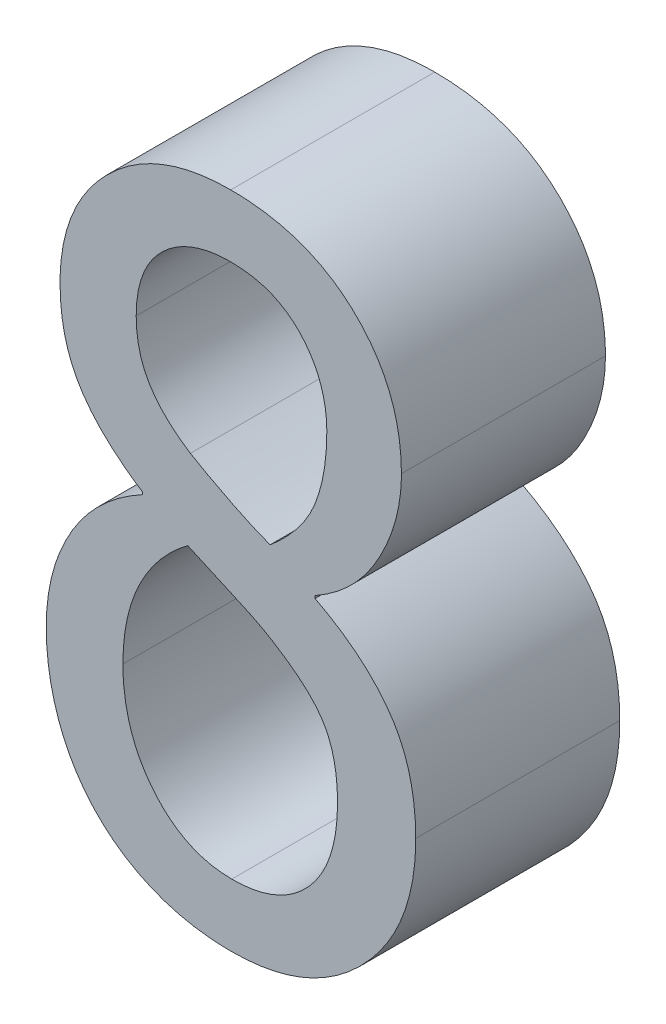
ISO-10303-21;
HEADER;
FILE_DESCRIPTION(('STEP AP214'),'2;1');
FILE_NAME('part.step','',(''),(''),'','','');
FILE_SCHEMA(('AUTOMOTIVE_DESIGN { 1 0 10303 214 1 1 1 1 }'));
ENDSEC;
DATA;
#1=APPLICATION_CONTEXT('core data for automotive mechanical design processes');
#2=APPLICATION_PROTOCOL_DEFINITION('international standard','automotive_design',2000,#1);
#3=PRODUCT_CONTEXT('',#1,'mechanical');
#4=PRODUCT('Part','Part','',(#3));
#5=PRODUCT_RELATED_PRODUCT_CATEGORY('part','',(#4));
#6=PRODUCT_DEFINITION_FORMATION('','',#4);
#7=PRODUCT_DEFINITION_CONTEXT('part definition',#1,'design');
#8=PRODUCT_DEFINITION('design','',#6,#7);
#9=PRODUCT_DEFINITION_SHAPE('','',#8);
#10=(LENGTH_UNIT() NAMED_UNIT(*) SI_UNIT(.MILLI.,.METRE.));
#11=(NAMED_UNIT(*) PLANE_ANGLE_UNIT() SI_UNIT($,.RADIAN.));
#12=(NAMED_UNIT(*) SI_UNIT($,.STERADIAN.) SOLID_ANGLE_UNIT());
#13=UNCERTAINTY_MEASURE_WITH_UNIT(LENGTH_MEASURE(1.E-05),#10,'distance_accuracy_value','');
#14=(GEOMETRIC_REPRESENTATION_CONTEXT(3) GLOBAL_UNCERTAINTY_ASSIGNED_CONTEXT((#13)) GLOBAL_UNIT_ASSIGNED_CONTEXT((#10,
#11,#12)) REPRESENTATION_CONTEXT('',''));
#15=CARTESIAN_POINT('',(0.,0.,0.));
#16=DIRECTION('',(0.,0.,1.));
#17=DIRECTION('',(1.,0.,0.));
#18=AXIS2_PLACEMENT_3D('',#15,#16,#17);
#19=CARTESIAN_POINT('',(-3.974147968209,0.364519019429397,0.));
#20=CARTESIAN_POINT('',(-3.974147968209,0.364519019429397,0.1));
#21=CARTESIAN_POINT('',(-3.957866192846,0.378295906275356,0.));
#22=CARTESIAN_POINT('',(-3.957866192846,0.378295906275356,0.1));
#23=CARTESIAN_POINT('',(-3.946343705665,0.407603101929486,0.));
#24=CARTESIAN_POINT('',(-3.946343705665,0.407603101929486,0.1));
#25=CARTESIAN_POINT('',(-3.946343705665,0.426389765810338,0.));
#26=CARTESIAN_POINT('',(-3.946343705665,0.426389765810338,0.1));
#27=B_SPLINE_SURFACE_WITH_KNOTS('',2,1,((#19,#20),(#21,#22),(#23,#24),(#25,#26)),.UNSPECIFIED.,
.F.,.F.,.F.,(3,1,3),(2,2),(0.,1.,2.),(0.,0.01),.UNSPECIFIED.);
#28=CARTESIAN_POINT('',(-3.974147968209,0.364519019429397,0.));
#29=CARTESIAN_POINT('',(-3.957866192846,0.378295906275356,0.));
#30=CARTESIAN_POINT('',(-3.946343705665,0.407603101929486,0.));
#31=CARTESIAN_POINT('',(-3.946343705665,0.426389765810338,0.));
#32=B_SPLINE_CURVE_WITH_KNOTS('',2,(#28,#29,#30,#31),.UNSPECIFIED.,.F.,.F.,(3,1,3),(0.,1.,2.),.UNSPECIFIED.);
#33=CARTESIAN_POINT('',(-3.974147968209,0.364519019429397,0.));
#34=VERTEX_POINT('',#33);
#35=CARTESIAN_POINT('',(-3.946343705665,0.426389765810338,0.));
#36=VERTEX_POINT('',#35);
#37=EDGE_CURVE('E11',#34,#36,#32,.T.);
#38=DIRECTION('',(0.,0.,1.));
#39=VECTOR('',#38,1.);
#40=CARTESIAN_POINT('',(-3.974147968209,0.364519019429397,0.));
#41=LINE('',#40,#39);
#42=CARTESIAN_POINT('',(-3.974147968209,0.364519019429397,0.1));
#43=VERTEX_POINT('',#42);
#44=EDGE_CURVE('E28',#34,#43,#41,.T.);
#45=CARTESIAN_POINT('',(-3.946343705665,0.426389765810338,0.1));
#46=CARTESIAN_POINT('',(-3.946343705665,0.407603101929486,0.1));
#47=CARTESIAN_POINT('',(-3.957866192846,0.378295906275356,0.1));
#48=CARTESIAN_POINT('',(-3.974147968209,0.364519019429397,0.1));
#49=B_SPLINE_CURVE_WITH_KNOTS('',2,(#45,#46,#47,#48),.UNSPECIFIED.,.F.,.F.,(3,1,3),(-2.,-1.,0.),.UNSPECIFIED.);
#50=CARTESIAN_POINT('',(-3.946343705665,0.426389765810338,0.1));
#51=VERTEX_POINT('',#50);
#52=EDGE_CURVE('E513',#51,#43,#49,.T.);
#53=DIRECTION('',(0.,0.,1.));
#54=VECTOR('',#53,1.);
#55=CARTESIAN_POINT('',(-3.946343705665,0.426389765810338,0.));
#56=LINE('',#55,#54);
#57=EDGE_CURVE('E41',#36,#51,#56,.T.);
#58=ORIENTED_EDGE('',*,*,#37,.F.);
#59=ORIENTED_EDGE('',*,*,#44,.T.);
#60=ORIENTED_EDGE('',*,*,#52,.F.);
#61=ORIENTED_EDGE('',*,*,#57,.F.);
#62=EDGE_LOOP('',(#58,#59,#60,#61));
#63=FACE_BOUND('',#62,.T.);
#64=ADVANCED_FACE('F17',(#63),#27,.F.);
#65=CARTESIAN_POINT('',(-4.013224229081,0.383806661013739,0.));
#66=CARTESIAN_POINT('',(-4.013224229081,0.383806661013739,0.1));
#67=CARTESIAN_POINT('',(-4.007462985491,0.380299817089313,0.));
#68=CARTESIAN_POINT('',(-4.007462985491,0.380299817089313,0.1));
#69=CARTESIAN_POINT('',(-3.983666544575,0.368025863353823,0.));
#70=CARTESIAN_POINT('',(-3.983666544575,0.368025863353823,0.1));
#71=CARTESIAN_POINT('',(-3.974147968209,0.364519019429397,0.));
#72=CARTESIAN_POINT('',(-3.974147968209,0.364519019429397,0.1));
#73=B_SPLINE_SURFACE_WITH_KNOTS('',2,1,((#65,#66),(#67,#68),(#69,#70),(#71,#72)),.UNSPECIFIED.,
.F.,.F.,.F.,(3,1,3),(2,2),(0.,1.,2.),(0.,0.01),.UNSPECIFIED.);
#74=CARTESIAN_POINT('',(-4.013224229081,0.383806661013739,0.));
#75=CARTESIAN_POINT('',(-4.007462985491,0.380299817089313,0.));
#76=CARTESIAN_POINT('',(-3.983666544575,0.368025863353823,0.));
#77=CARTESIAN_POINT('',(-3.974147968209,0.364519019429397,0.));
#78=B_SPLINE_CURVE_WITH_KNOTS('',2,(#74,#75,#76,#77),.UNSPECIFIED.,.F.,.F.,(3,1,3),(0.,1.,2.),.UNSPECIFIED.);
#79=CARTESIAN_POINT('',(-4.013224229081,0.383806661013739,0.));
#80=VERTEX_POINT('',#79);
#81=EDGE_CURVE('E504',#80,#34,#78,.T.);
#82=DIRECTION('',(0.,0.,1.));
#83=VECTOR('',#82,1.);
#84=CARTESIAN_POINT('',(-4.013224229081,0.383806661013739,0.));
#85=LINE('',#84,#83);
#86=CARTESIAN_POINT('',(-4.013224229081,0.383806661013739,0.1));
#87=VERTEX_POINT('',#86);
#88=EDGE_CURVE('E498',#80,#87,#85,.T.);
#89=CARTESIAN_POINT('',(-3.974147968209,0.364519019429397,0.1));
#90=CARTESIAN_POINT('',(-3.983666544575,0.368025863353823,0.1));
#91=CARTESIAN_POINT('',(-4.007462985491,0.380299817089313,0.1));
#92=CARTESIAN_POINT('',(-4.013224229081,0.383806661013739,0.1));
#93=B_SPLINE_CURVE_WITH_KNOTS('',2,(#89,#90,#91,#92),.UNSPECIFIED.,.F.,.F.,(3,1,3),(-2.,-1.,0.),.UNSPECIFIED.);
#94=EDGE_CURVE('E491',#43,#87,#93,.T.);
#95=ORIENTED_EDGE('',*,*,#81,.F.);
#96=ORIENTED_EDGE('',*,*,#88,.T.);
#97=ORIENTED_EDGE('',*,*,#94,.F.);
#98=ORIENTED_EDGE('',*,*,#44,.F.);
#99=EDGE_LOOP('',(#95,#96,#97,#98));
#100=FACE_BOUND('',#99,.T.);
#101=ADVANCED_FACE('F519',(#100),#73,.F.);
#102=CARTESIAN_POINT('',(-4.039776047366,0.428894654327785,0.));
#103=CARTESIAN_POINT('',(-4.039776047366,0.428894654327785,0.1));
#104=CARTESIAN_POINT('',(-4.039776047366,0.413614834371358,0.));
#105=CARTESIAN_POINT('',(-4.039776047366,0.413614834371358,0.1));
#106=CARTESIAN_POINT('',(-4.026500138224,0.392323281973059,0.));
#107=CARTESIAN_POINT('',(-4.026500138224,0.392323281973059,0.1));
#108=CARTESIAN_POINT('',(-4.013224229081,0.383806661013739,0.));
#109=CARTESIAN_POINT('',(-4.013224229081,0.383806661013739,0.1));
#110=B_SPLINE_SURFACE_WITH_KNOTS('',2,1,((#102,#103),(#104,#105),(#106,#107),(#108,#109)),
.UNSPECIFIED.,.F.,.F.,.F.,(3,1,3),(2,2),(0.,1.,2.),(0.,0.01),.UNSPECIFIED.);
#111=CARTESIAN_POINT('',(-4.039776047366,0.428894654327785,0.));
#112=CARTESIAN_POINT('',(-4.039776047366,0.413614834371358,0.));
#113=CARTESIAN_POINT('',(-4.026500138224,0.392323281973059,0.));
#114=CARTESIAN_POINT('',(-4.013224229081,0.383806661013739,0.));
#115=B_SPLINE_CURVE_WITH_KNOTS('',2,(#111,#112,#113,#114),.UNSPECIFIED.,.F.,.F.,(3,1,3),(0.,1.,
2.),.UNSPECIFIED.);
#116=CARTESIAN_POINT('',(-4.039776047366,0.428894654327785,0.));
#117=VERTEX_POINT('',#116);
#118=EDGE_CURVE('E486',#117,#80,#115,.T.);
#119=DIRECTION('',(0.,0.,1.));
#120=VECTOR('',#119,1.);
#121=CARTESIAN_POINT('',(-4.039776047366,0.428894654327785,0.));
#122=LINE('',#121,#120);
#123=CARTESIAN_POINT('',(-4.039776047366,0.428894654327785,0.1));
#124=VERTEX_POINT('',#123);
#125=EDGE_CURVE('E480',#117,#124,#122,.T.);
#126=CARTESIAN_POINT('',(-4.013224229081,0.383806661013739,0.1));
#127=CARTESIAN_POINT('',(-4.026500138224,0.392323281973059,0.1));
#128=CARTESIAN_POINT('',(-4.039776047366,0.413614834371358,0.1));
#129=CARTESIAN_POINT('',(-4.039776047366,0.428894654327785,0.1));
#130=B_SPLINE_CURVE_WITH_KNOTS('',2,(#126,#127,#128,#129),.UNSPECIFIED.,.F.,.F.,(3,1,3),(-2.,
-1.,0.),.UNSPECIFIED.);
#131=EDGE_CURVE('E473',#87,#124,#130,.T.);
#132=ORIENTED_EDGE('',*,*,#118,.F.);
#133=ORIENTED_EDGE('',*,*,#125,.T.);
#134=ORIENTED_EDGE('',*,*,#131,.F.);
#135=ORIENTED_EDGE('',*,*,#88,.F.);
#136=EDGE_LOOP('',(#132,#133,#134,#135));
#137=FACE_BOUND('',#136,.T.);
#138=ADVANCED_FACE('F533',(#137),#110,.F.);
#139=CARTESIAN_POINT('',(-3.993435609793,0.47498460304881,0.));
#140=CARTESIAN_POINT('',(-3.993435609793,0.47498460304881,0.1));
#141=CARTESIAN_POINT('',(-4.013975695636,0.47498460304881,0.));
#142=CARTESIAN_POINT('',(-4.013975695636,0.47498460304881,0.1));
#143=CARTESIAN_POINT('',(-4.039776047366,0.450186206726085,0.));
#144=CARTESIAN_POINT('',(-4.039776047366,0.450186206726085,0.1));
#145=CARTESIAN_POINT('',(-4.039776047366,0.428894654327785,0.));
#146=CARTESIAN_POINT('',(-4.039776047366,0.428894654327785,0.1));
#147=B_SPLINE_SURFACE_WITH_KNOTS('',2,1,((#139,#140),(#141,#142),(#143,#144),(#145,#146)),
.UNSPECIFIED.,.F.,.F.,.F.,(3,1,3),(2,2),(0.,1.,2.),(0.,0.01),.UNSPECIFIED.);
#148=CARTESIAN_POINT('',(-3.993435609793,0.47498460304881,0.));
#149=CARTESIAN_POINT('',(-4.013975695636,0.47498460304881,0.));
#150=CARTESIAN_POINT('',(-4.039776047366,0.450186206726085,0.));
#151=CARTESIAN_POINT('',(-4.039776047366,0.428894654327785,0.));
#152=B_SPLINE_CURVE_WITH_KNOTS('',2,(#148,#149,#150,#151),.UNSPECIFIED.,.F.,.F.,(3,1,3),(0.,1.,
2.),.UNSPECIFIED.);
#153=CARTESIAN_POINT('',(-3.993435609793,0.47498460304881,0.));
#154=VERTEX_POINT('',#153);
#155=EDGE_CURVE('E468',#154,#117,#152,.T.);
#156=DIRECTION('',(0.,0.,1.));
#157=VECTOR('',#156,1.);
#158=CARTESIAN_POINT('',(-3.993435609793,0.47498460304881,0.));
#159=LINE('',#158,#157);
#160=CARTESIAN_POINT('',(-3.993435609793,0.47498460304881,0.1));
#161=VERTEX_POINT('',#160);
#162=EDGE_CURVE('E462',#154,#161,#159,.T.);
#163=CARTESIAN_POINT('',(-4.039776047366,0.428894654327785,0.1));
#164=CARTESIAN_POINT('',(-4.039776047366,0.450186206726085,0.1));
#165=CARTESIAN_POINT('',(-4.013975695636,0.47498460304881,0.1));
#166=CARTESIAN_POINT('',(-3.993435609793,0.47498460304881,0.1));
#167=B_SPLINE_CURVE_WITH_KNOTS('',2,(#163,#164,#165,#166),.UNSPECIFIED.,.F.,.F.,(3,1,3),(-2.,
-1.,0.),.UNSPECIFIED.);
#168=EDGE_CURVE('E455',#124,#161,#167,.T.);
#169=ORIENTED_EDGE('',*,*,#155,.F.);
#170=ORIENTED_EDGE('',*,*,#162,.T.);
#171=ORIENTED_EDGE('',*,*,#168,.F.);
#172=ORIENTED_EDGE('',*,*,#125,.F.);
#173=EDGE_LOOP('',(#169,#170,#171,#172));
#174=FACE_BOUND('',#173,.T.);
#175=ADVANCED_FACE('F535',(#174),#147,.F.);
#176=CARTESIAN_POINT('',(-3.946343705665,0.426389765810338,0.));
#177=CARTESIAN_POINT('',(-3.946343705665,0.426389765810338,0.1));
#178=CARTESIAN_POINT('',(-3.946343705665,0.447180340505148,0.));
#179=CARTESIAN_POINT('',(-3.946343705665,0.447180340505148,0.1));
#180=CARTESIAN_POINT('',(-3.97139259084,0.47498460304881,0.));
#181=CARTESIAN_POINT('',(-3.97139259084,0.47498460304881,0.1));
#182=CARTESIAN_POINT('',(-3.993435609793,0.47498460304881,0.));
#183=CARTESIAN_POINT('',(-3.993435609793,0.47498460304881,0.1));
#184=B_SPLINE_SURFACE_WITH_KNOTS('',2,1,((#176,#177),(#178,#179),(#180,#181),(#182,#183)),
.UNSPECIFIED.,.F.,.F.,.F.,(3,1,3),(2,2),(0.,1.,2.),(0.,0.01),.UNSPECIFIED.);
#185=CARTESIAN_POINT('',(-3.946343705665,0.426389765810338,0.));
#186=CARTESIAN_POINT('',(-3.946343705665,0.447180340505148,0.));
#187=CARTESIAN_POINT('',(-3.97139259084,0.47498460304881,0.));
#188=CARTESIAN_POINT('',(-3.993435609793,0.47498460304881,0.));
#189=B_SPLINE_CURVE_WITH_KNOTS('',2,(#185,#186,#187,#188),.UNSPECIFIED.,.F.,.F.,(3,1,3),(0.,1.,
2.),.UNSPECIFIED.);
#190=EDGE_CURVE('E447',#36,#154,#189,.T.);
#191=CARTESIAN_POINT('',(-3.993435609793,0.47498460304881,0.1));
#192=CARTESIAN_POINT('',(-3.97139259084,0.47498460304881,0.1));
#193=CARTESIAN_POINT('',(-3.946343705665,0.447180340505148,0.1));
#194=CARTESIAN_POINT('',(-3.946343705665,0.426389765810338,0.1));
#195=B_SPLINE_CURVE_WITH_KNOTS('',2,(#191,#192,#193,#194),.UNSPECIFIED.,.F.,.F.,(3,1,3),(-2.,
-1.,0.),.UNSPECIFIED.);
#196=EDGE_CURVE('E439',#161,#51,#195,.T.);
#197=ORIENTED_EDGE('',*,*,#190,.F.);
#198=ORIENTED_EDGE('',*,*,#57,.T.);
#199=ORIENTED_EDGE('',*,*,#196,.F.);
#200=ORIENTED_EDGE('',*,*,#162,.F.);
#201=EDGE_LOOP('',(#197,#198,#199,#200));
#202=FACE_BOUND('',#201,.T.);
#203=ADVANCED_FACE('F526',(#202),#184,.F.);
#204=CARTESIAN_POINT('',(-3.99293463209,0.213223752975599,0.));
#205=CARTESIAN_POINT('',(-3.99293463209,0.213223752975599,0.1));
#206=CARTESIAN_POINT('',(-3.969388680026,0.213223752975599,0.));
#207=CARTESIAN_POINT('',(-3.969388680026,0.213223752975599,0.1));
#208=CARTESIAN_POINT('',(-3.941083439779,0.244534859443686,0.));
#209=CARTESIAN_POINT('',(-3.941083439779,0.244534859443686,0.1));
#210=CARTESIAN_POINT('',(-3.941083439779,0.271587655432114,0.));
#211=CARTESIAN_POINT('',(-3.941083439779,0.271587655432114,0.1));
#212=B_SPLINE_SURFACE_WITH_KNOTS('',2,1,((#204,#205),(#206,#207),(#208,#209),(#210,#211)),
.UNSPECIFIED.,.F.,.F.,.F.,(3,1,3),(2,2),(0.,1.,2.),(0.,0.01),.UNSPECIFIED.);
#213=CARTESIAN_POINT('',(-3.99293463209,0.213223752975599,0.));
#214=CARTESIAN_POINT('',(-3.969388680026,0.213223752975599,0.));
#215=CARTESIAN_POINT('',(-3.941083439779,0.244534859443686,0.));
#216=CARTESIAN_POINT('',(-3.941083439779,0.271587655432114,0.));
#217=B_SPLINE_CURVE_WITH_KNOTS('',2,(#213,#214,#215,#216),.UNSPECIFIED.,.F.,.F.,(3,1,3),(0.,1.,
2.),.UNSPECIFIED.);
#218=CARTESIAN_POINT('',(-3.99293463209,0.213223752975599,0.));
#219=VERTEX_POINT('',#218);
#220=CARTESIAN_POINT('',(-3.941083439779,0.271587655432114,0.));
#221=VERTEX_POINT('',#220);
#222=EDGE_CURVE('E434',#219,#221,#217,.T.);
#223=DIRECTION('',(0.,0.,1.));
#224=VECTOR('',#223,1.);
#225=CARTESIAN_POINT('',(-3.99293463209,0.213223752975599,0.));
#226=LINE('',#225,#224);
#227=CARTESIAN_POINT('',(-3.99293463209,0.213223752975599,0.1));
#228=VERTEX_POINT('',#227);
#229=EDGE_CURVE('E428',#219,#228,#226,.T.);
#230=CARTESIAN_POINT('',(-3.941083439779,0.271587655432114,0.1));
#231=CARTESIAN_POINT('',(-3.941083439779,0.244534859443686,0.1));
#232=CARTESIAN_POINT('',(-3.969388680026,0.213223752975599,0.1));
#233=CARTESIAN_POINT('',(-3.99293463209,0.213223752975599,0.1));
#234=B_SPLINE_CURVE_WITH_KNOTS('',2,(#230,#231,#232,#233),.UNSPECIFIED.,.F.,.F.,(3,1,3),(-2.,
-1.,0.),.UNSPECIFIED.);
#235=CARTESIAN_POINT('',(-3.941083439779,0.271587655432114,0.1));
#236=VERTEX_POINT('',#235);
#237=EDGE_CURVE('E424',#236,#228,#234,.T.);
#238=DIRECTION('',(0.,0.,1.));
#239=VECTOR('',#238,1.);
#240=CARTESIAN_POINT('',(-3.941083439779,0.271587655432114,0.));
#241=LINE('',#240,#239);
#242=EDGE_CURVE('E419',#221,#236,#241,.T.);
#243=ORIENTED_EDGE('',*,*,#222,.F.);
#244=ORIENTED_EDGE('',*,*,#229,.T.);
#245=ORIENTED_EDGE('',*,*,#237,.F.);
#246=ORIENTED_EDGE('',*,*,#242,.F.);
#247=EDGE_LOOP('',(#243,#244,#245,#246));
#248=FACE_BOUND('',#247,.T.);
#249=ADVANCED_FACE('F543',(#248),#212,.F.);
#250=CARTESIAN_POINT('',(-4.046288757512,0.277849876725731,0.));
#251=CARTESIAN_POINT('',(-4.046288757512,0.277849876725731,0.1));
#252=CARTESIAN_POINT('',(-4.046288757512,0.249795125330325,0.));
#253=CARTESIAN_POINT('',(-4.046288757512,0.249795125330325,0.1));
#254=CARTESIAN_POINT('',(-4.01597960645,0.213223752975599,0.));
#255=CARTESIAN_POINT('',(-4.01597960645,0.213223752975599,0.1));
#256=CARTESIAN_POINT('',(-3.99293463209,0.213223752975599,0.));
#257=CARTESIAN_POINT('',(-3.99293463209,0.213223752975599,0.1));
#258=B_SPLINE_SURFACE_WITH_KNOTS('',2,1,((#250,#251),(#252,#253),(#254,#255),(#256,#257)),
.UNSPECIFIED.,.F.,.F.,.F.,(3,1,3),(2,2),(0.,1.,2.),(0.,0.01),.UNSPECIFIED.);
#259=CARTESIAN_POINT('',(-4.046288757512,0.277849876725731,0.));
#260=CARTESIAN_POINT('',(-4.046288757512,0.249795125330325,0.));
#261=CARTESIAN_POINT('',(-4.01597960645,0.213223752975599,0.));
#262=CARTESIAN_POINT('',(-3.99293463209,0.213223752975599,0.));
#263=B_SPLINE_CURVE_WITH_KNOTS('',2,(#259,#260,#261,#262),.UNSPECIFIED.,.F.,.F.,(3,1,3),(0.,1.,
2.),.UNSPECIFIED.);
#264=CARTESIAN_POINT('',(-4.046288757512,0.277849876725731,0.));
#265=VERTEX_POINT('',#264);
#266=EDGE_CURVE('E414',#265,#219,#263,.T.);
#267=DIRECTION('',(0.,0.,1.));
#268=VECTOR('',#267,1.);
#269=CARTESIAN_POINT('',(-4.046288757512,0.277849876725731,0.));
#270=LINE('',#269,#268);
#271=CARTESIAN_POINT('',(-4.046288757512,0.277849876725731,0.1));
#272=VERTEX_POINT('',#271);
#273=EDGE_CURVE('E408',#265,#272,#270,.T.);
#274=CARTESIAN_POINT('',(-3.99293463209,0.213223752975599,0.1));
#275=CARTESIAN_POINT('',(-4.01597960645,0.213223752975599,0.1));
#276=CARTESIAN_POINT('',(-4.046288757512,0.249795125330325,0.1));
#277=CARTESIAN_POINT('',(-4.046288757512,0.277849876725731,0.1));
#278=B_SPLINE_CURVE_WITH_KNOTS('',2,(#274,#275,#276,#277),.UNSPECIFIED.,.F.,.F.,(3,1,3),(-2.,
-1.,0.),.UNSPECIFIED.);
#279=EDGE_CURVE('E401',#228,#272,#278,.T.);
#280=ORIENTED_EDGE('',*,*,#266,.F.);
#281=ORIENTED_EDGE('',*,*,#273,.T.);
#282=ORIENTED_EDGE('',*,*,#279,.F.);
#283=ORIENTED_EDGE('',*,*,#229,.F.);
#284=EDGE_LOOP('',(#280,#281,#282,#283));
#285=FACE_BOUND('',#284,.T.);
#286=ADVANCED_FACE('F599',(#285),#258,.F.);
#287=CARTESIAN_POINT('',(-4.01447667334,0.343978933586332,0.));
#288=CARTESIAN_POINT('',(-4.01447667334,0.343978933586332,0.1));
#289=CARTESIAN_POINT('',(-4.029756493296,0.33270693525782,0.));
#290=CARTESIAN_POINT('',(-4.029756493296,0.33270693525782,0.1));
#291=CARTESIAN_POINT('',(-4.046288757512,0.299141429124031,0.));
#292=CARTESIAN_POINT('',(-4.046288757512,0.299141429124031,0.1));
#293=CARTESIAN_POINT('',(-4.046288757512,0.277849876725731,0.));
#294=CARTESIAN_POINT('',(-4.046288757512,0.277849876725731,0.1));
#295=B_SPLINE_SURFACE_WITH_KNOTS('',2,1,((#287,#288),(#289,#290),(#291,#292),(#293,#294)),
.UNSPECIFIED.,.F.,.F.,.F.,(3,1,3),(2,2),(0.,1.,2.),(0.,0.01),.UNSPECIFIED.);
#296=CARTESIAN_POINT('',(-4.01447667334,0.343978933586332,0.));
#297=CARTESIAN_POINT('',(-4.029756493296,0.33270693525782,0.));
#298=CARTESIAN_POINT('',(-4.046288757512,0.299141429124031,0.));
#299=CARTESIAN_POINT('',(-4.046288757512,0.277849876725731,0.));
#300=B_SPLINE_CURVE_WITH_KNOTS('',2,(#296,#297,#298,#299),.UNSPECIFIED.,.F.,.F.,(3,1,3),(0.,1.,
2.),.UNSPECIFIED.);
#301=CARTESIAN_POINT('',(-4.01447667334,0.343978933586332,0.));
#302=VERTEX_POINT('',#301);
#303=EDGE_CURVE('E396',#302,#265,#300,.T.);
#304=DIRECTION('',(0.,0.,1.));
#305=VECTOR('',#304,1.);
#306=CARTESIAN_POINT('',(-4.01447667334,0.343978933586332,0.));
#307=LINE('',#306,#305);
#308=CARTESIAN_POINT('',(-4.01447667334,0.343978933586332,0.1));
#309=VERTEX_POINT('',#308);
#310=EDGE_CURVE('E390',#302,#309,#307,.T.);
#311=CARTESIAN_POINT('',(-4.046288757512,0.277849876725731,0.1));
#312=CARTESIAN_POINT('',(-4.046288757512,0.299141429124031,0.1));
#313=CARTESIAN_POINT('',(-4.029756493296,0.33270693525782,0.1));
#314=CARTESIAN_POINT('',(-4.01447667334,0.343978933586332,0.1));
#315=B_SPLINE_CURVE_WITH_KNOTS('',2,(#311,#312,#313,#314),.UNSPECIFIED.,.F.,.F.,(3,1,3),(-2.,
-1.,0.),.UNSPECIFIED.);
#316=EDGE_CURVE('E383',#272,#309,#315,.T.);
#317=ORIENTED_EDGE('',*,*,#303,.F.);
#318=ORIENTED_EDGE('',*,*,#310,.T.);
#319=ORIENTED_EDGE('',*,*,#316,.F.);
#320=ORIENTED_EDGE('',*,*,#273,.F.);
#321=EDGE_LOOP('',(#317,#318,#319,#320));
#322=FACE_BOUND('',#321,.T.);
#323=ADVANCED_FACE('F609',(#322),#295,.F.);
#324=CARTESIAN_POINT('',(-3.973646990506,0.32469129200199,0.));
#325=CARTESIAN_POINT('',(-3.973646990506,0.32469129200199,0.1));
#326=CARTESIAN_POINT('',(-3.980159700651,0.328699113629905,0.));
#327=CARTESIAN_POINT('',(-3.980159700651,0.328699113629905,0.1));
#328=CARTESIAN_POINT('',(-4.001200764197,0.337967201144459,0.));
#329=CARTESIAN_POINT('',(-4.001200764197,0.337967201144459,0.1));
#330=CARTESIAN_POINT('',(-4.01447667334,0.343978933586332,0.));
#331=CARTESIAN_POINT('',(-4.01447667334,0.343978933586332,0.1));
#332=B_SPLINE_SURFACE_WITH_KNOTS('',2,1,((#324,#325),(#326,#327),(#328,#329),(#330,#331)),
.UNSPECIFIED.,.F.,.F.,.F.,(3,1,3),(2,2),(0.,1.,2.),(0.,0.01),.UNSPECIFIED.);
#333=CARTESIAN_POINT('',(-3.973646990506,0.32469129200199,0.));
#334=CARTESIAN_POINT('',(-3.980159700651,0.328699113629905,0.));
#335=CARTESIAN_POINT('',(-4.001200764197,0.337967201144459,0.));
#336=CARTESIAN_POINT('',(-4.01447667334,0.343978933586332,0.));
#337=B_SPLINE_CURVE_WITH_KNOTS('',2,(#333,#334,#335,#336),.UNSPECIFIED.,.F.,.F.,(3,1,3),(0.,1.,
2.),.UNSPECIFIED.);
#338=CARTESIAN_POINT('',(-3.973646990506,0.32469129200199,0.));
#339=VERTEX_POINT('',#338);
#340=EDGE_CURVE('E378',#339,#302,#337,.T.);
#341=DIRECTION('',(0.,0.,1.));
#342=VECTOR('',#341,1.);
#343=CARTESIAN_POINT('',(-3.973646990506,0.32469129200199,0.));
#344=LINE('',#343,#342);
#345=CARTESIAN_POINT('',(-3.973646990506,0.32469129200199,0.1));
#346=VERTEX_POINT('',#345);
#347=EDGE_CURVE('E372',#339,#346,#344,.T.);
#348=CARTESIAN_POINT('',(-4.01447667334,0.343978933586332,0.1));
#349=CARTESIAN_POINT('',(-4.001200764197,0.337967201144459,0.1));
#350=CARTESIAN_POINT('',(-3.980159700651,0.328699113629905,0.1));
#351=CARTESIAN_POINT('',(-3.973646990506,0.32469129200199,0.1));
#352=B_SPLINE_CURVE_WITH_KNOTS('',2,(#348,#349,#350,#351),.UNSPECIFIED.,.F.,.F.,(3,1,3),(-2.,
-1.,0.),.UNSPECIFIED.);
#353=EDGE_CURVE('E365',#309,#346,#352,.T.);
#354=ORIENTED_EDGE('',*,*,#340,.F.);
#355=ORIENTED_EDGE('',*,*,#347,.T.);
#356=ORIENTED_EDGE('',*,*,#353,.F.);
#357=ORIENTED_EDGE('',*,*,#310,.F.);
#358=EDGE_LOOP('',(#354,#355,#356,#357));
#359=FACE_BOUND('',#358,.T.);
#360=ADVANCED_FACE('F619',(#359),#332,.F.);
#361=CARTESIAN_POINT('',(-3.941083439779,0.271587655432114,0.));
#362=CARTESIAN_POINT('',(-3.941083439779,0.271587655432114,0.1));
#363=CARTESIAN_POINT('',(-3.941083439779,0.290624808164711,0.));
#364=CARTESIAN_POINT('',(-3.941083439779,0.290624808164711,0.1));
#365=CARTESIAN_POINT('',(-3.954609837773,0.313168804821734,0.));
#366=CARTESIAN_POINT('',(-3.954609837773,0.313168804821734,0.1));
#367=CARTESIAN_POINT('',(-3.973646990506,0.32469129200199,0.));
#368=CARTESIAN_POINT('',(-3.973646990506,0.32469129200199,0.1));
#369=B_SPLINE_SURFACE_WITH_KNOTS('',2,1,((#361,#362),(#363,#364),(#365,#366),(#367,#368)),
.UNSPECIFIED.,.F.,.F.,.F.,(3,1,3),(2,2),(0.,1.,2.),(0.,0.01),.UNSPECIFIED.);
#370=CARTESIAN_POINT('',(-3.941083439779,0.271587655432114,0.));
#371=CARTESIAN_POINT('',(-3.941083439779,0.290624808164711,0.));
#372=CARTESIAN_POINT('',(-3.954609837773,0.313168804821734,0.));
#373=CARTESIAN_POINT('',(-3.973646990506,0.32469129200199,0.));
#374=B_SPLINE_CURVE_WITH_KNOTS('',2,(#370,#371,#372,#373),.UNSPECIFIED.,.F.,.F.,(3,1,3),(0.,1.,
2.),.UNSPECIFIED.);
#375=EDGE_CURVE('E357',#221,#339,#374,.T.);
#376=CARTESIAN_POINT('',(-3.973646990506,0.32469129200199,0.1));
#377=CARTESIAN_POINT('',(-3.954609837773,0.313168804821734,0.1));
#378=CARTESIAN_POINT('',(-3.941083439779,0.290624808164711,0.1));
#379=CARTESIAN_POINT('',(-3.941083439779,0.271587655432114,0.1));
#380=B_SPLINE_CURVE_WITH_KNOTS('',2,(#376,#377,#378,#379),.UNSPECIFIED.,.F.,.F.,(3,1,3),(-2.,
-1.,0.),.UNSPECIFIED.);
#381=EDGE_CURVE('E349',#346,#236,#380,.T.);
#382=ORIENTED_EDGE('',*,*,#375,.F.);
#383=ORIENTED_EDGE('',*,*,#242,.T.);
#384=ORIENTED_EDGE('',*,*,#381,.F.);
#385=ORIENTED_EDGE('',*,*,#347,.F.);
#386=EDGE_LOOP('',(#382,#383,#384,#385));
#387=FACE_BOUND('',#386,.T.);
#388=ADVANCED_FACE('F629',(#387),#369,.F.);
#389=CARTESIAN_POINT('',(-4.083862085273,0.274844010504795,0.));
#390=CARTESIAN_POINT('',(-4.083862085273,0.274844010504795,0.1));
#391=CARTESIAN_POINT('',(-4.083862085273,0.255556368920453,0.));
#392=CARTESIAN_POINT('',(-4.083862085273,0.255556368920453,0.1));
#393=CARTESIAN_POINT('',(-4.071838620389,0.221489885083174,0.));
#394=CARTESIAN_POINT('',(-4.071838620389,0.221489885083174,0.1));
#395=CARTESIAN_POINT('',(-4.060065644357,0.208965442495939,0.));
#396=CARTESIAN_POINT('',(-4.060065644357,0.208965442495939,0.1));
#397=B_SPLINE_SURFACE_WITH_KNOTS('',2,1,((#389,#390),(#391,#392),(#393,#394),(#395,#396)),
.UNSPECIFIED.,.F.,.F.,.F.,(3,1,3),(2,2),(-2.,-1.,0.),(0.,0.01),.UNSPECIFIED.);
#398=CARTESIAN_POINT('',(-4.060065644357,0.208965442495939,0.));
#399=CARTESIAN_POINT('',(-4.071838620389,0.221489885083174,0.));
#400=CARTESIAN_POINT('',(-4.083862085273,0.255556368920453,0.));
#401=CARTESIAN_POINT('',(-4.083862085273,0.274844010504795,0.));
#402=B_SPLINE_CURVE_WITH_KNOTS('',2,(#398,#399,#400,#401),.UNSPECIFIED.,.F.,.F.,(3,1,3),(0.,1.,
2.),.UNSPECIFIED.);
#403=CARTESIAN_POINT('',(-4.060065644357,0.208965442495939,0.));
#404=VERTEX_POINT('',#403);
#405=CARTESIAN_POINT('',(-4.083862085273,0.274844010504795,0.));
#406=VERTEX_POINT('',#405);
#407=EDGE_CURVE('E345',#404,#406,#402,.T.);
#408=DIRECTION('',(0.,0.,1.));
#409=VECTOR('',#408,1.);
#410=CARTESIAN_POINT('',(-4.060065644357,0.208965442495939,0.));
#411=LINE('',#410,#409);
#412=CARTESIAN_POINT('',(-4.060065644357,0.208965442495939,0.1));
#413=VERTEX_POINT('',#412);
#414=EDGE_CURVE('E340',#404,#413,#411,.T.);
#415=CARTESIAN_POINT('',(-4.083862085273,0.274844010504795,0.1));
#416=CARTESIAN_POINT('',(-4.083862085273,0.255556368920453,0.1));
#417=CARTESIAN_POINT('',(-4.071838620389,0.221489885083174,0.1));
#418=CARTESIAN_POINT('',(-4.060065644357,0.208965442495939,0.1));
#419=B_SPLINE_CURVE_WITH_KNOTS('',2,(#415,#416,#417,#418),.UNSPECIFIED.,.F.,.F.,(3,1,3),(-2.,
-1.,0.),.UNSPECIFIED.);
#420=CARTESIAN_POINT('',(-4.083862085273,0.274844010504795,0.1));
#421=VERTEX_POINT('',#420);
#422=EDGE_CURVE('E189',#421,#413,#419,.T.);
#423=DIRECTION('',(0.,0.,1.));
#424=VECTOR('',#423,1.);
#425=CARTESIAN_POINT('',(-4.083862085273,0.274844010504795,0.));
#426=LINE('',#425,#424);
#427=EDGE_CURVE('E331',#406,#421,#426,.T.);
#428=ORIENTED_EDGE('',*,*,#407,.F.);
#429=ORIENTED_EDGE('',*,*,#414,.T.);
#430=ORIENTED_EDGE('',*,*,#422,.F.);
#431=ORIENTED_EDGE('',*,*,#427,.F.);
#432=EDGE_LOOP('',(#428,#429,#430,#431));
#433=FACE_BOUND('',#432,.T.);
#434=ADVANCED_FACE('F639',(#433),#397,.T.);
#435=CARTESIAN_POINT('',(-4.036770181145,0.354499465359609,0.));
#436=CARTESIAN_POINT('',(-4.036770181145,0.354499465359609,0.1));
#437=CARTESIAN_POINT('',(-4.059815155506,0.341975022772374,0.));
#438=CARTESIAN_POINT('',(-4.059815155506,0.341975022772374,0.1));
#439=CARTESIAN_POINT('',(-4.083862085273,0.299892895679265,0.));
#440=CARTESIAN_POINT('',(-4.083862085273,0.299892895679265,0.1));
#441=CARTESIAN_POINT('',(-4.083862085273,0.274844010504795,0.));
#442=CARTESIAN_POINT('',(-4.083862085273,0.274844010504795,0.1));
#443=B_SPLINE_SURFACE_WITH_KNOTS('',2,1,((#435,#436),(#437,#438),(#439,#440),(#441,#442)),
.UNSPECIFIED.,.F.,.F.,.F.,(3,1,3),(2,2),(-2.,-1.,0.),(0.,0.01),.UNSPECIFIED.);
#444=CARTESIAN_POINT('',(-4.083862085273,0.274844010504795,0.));
#445=CARTESIAN_POINT('',(-4.083862085273,0.299892895679265,0.));
#446=CARTESIAN_POINT('',(-4.059815155506,0.341975022772374,0.));
#447=CARTESIAN_POINT('',(-4.036770181145,0.354499465359609,0.));
#448=B_SPLINE_CURVE_WITH_KNOTS('',2,(#444,#445,#446,#447),.UNSPECIFIED.,.F.,.F.,(3,1,3),(0.,1.,
2.),.UNSPECIFIED.);
#449=CARTESIAN_POINT('',(-4.036770181145,0.354499465359609,0.));
#450=VERTEX_POINT('',#449);
#451=EDGE_CURVE('E324',#406,#450,#448,.T.);
#452=CARTESIAN_POINT('',(-4.036770181145,0.354499465359609,0.1));
#453=CARTESIAN_POINT('',(-4.059815155506,0.341975022772374,0.1));
#454=CARTESIAN_POINT('',(-4.083862085273,0.299892895679265,0.1));
#455=CARTESIAN_POINT('',(-4.083862085273,0.274844010504795,0.1));
#456=B_SPLINE_CURVE_WITH_KNOTS('',2,(#452,#453,#454,#455),.UNSPECIFIED.,.F.,.F.,(3,1,3),(-2.,
-1.,0.),.UNSPECIFIED.);
#457=CARTESIAN_POINT('',(-4.036770181145,0.354499465359609,0.1));
#458=VERTEX_POINT('',#457);
#459=EDGE_CURVE('E320',#458,#421,#456,.T.);
#460=DIRECTION('',(0.,0.,1.));
#461=VECTOR('',#460,1.);
#462=CARTESIAN_POINT('',(-4.036770181145,0.354499465359609,0.));
#463=LINE('',#462,#461);
#464=EDGE_CURVE('E317',#450,#458,#463,.T.);
#465=ORIENTED_EDGE('',*,*,#451,.F.);
#466=ORIENTED_EDGE('',*,*,#427,.T.);
#467=ORIENTED_EDGE('',*,*,#459,.F.);
#468=ORIENTED_EDGE('',*,*,#464,.F.);
#469=EDGE_LOOP('',(#465,#466,#467,#468));
#470=FACE_BOUND('',#469,.T.);
#471=ADVANCED_FACE('F649',(#470),#443,.T.);
#472=CARTESIAN_POINT('',(-4.036770181145,0.355751909618333,0.));
#473=DIRECTION('',(-1.,0.,0.));
#474=DIRECTION('',(0.,-1.,0.));
#475=AXIS2_PLACEMENT_3D('',#472,#473,#474);
#476=PLANE('',#475);
#477=DIRECTION('',(0.,1.,0.));
#478=VECTOR('',#477,1.);
#479=CARTESIAN_POINT('',(-4.036770181145,0.354499465359609,0.));
#480=LINE('',#479,#478);
#481=CARTESIAN_POINT('',(-4.036770181145,0.355751909618333,0.));
#482=VERTEX_POINT('',#481);
#483=EDGE_CURVE('E315',#450,#482,#480,.T.);
#484=ORIENTED_EDGE('',*,*,#483,.F.);
#485=ORIENTED_EDGE('',*,*,#464,.T.);
#486=DIRECTION('',(0.,-1.,0.));
#487=VECTOR('',#486,1.);
#488=CARTESIAN_POINT('',(-4.036770181145,0.354499465359609,0.1));
#489=LINE('',#488,#487);
#490=CARTESIAN_POINT('',(-4.036770181145,0.355751909618333,0.1));
#491=VERTEX_POINT('',#490);
#492=EDGE_CURVE('E312',#491,#458,#489,.T.);
#493=ORIENTED_EDGE('',*,*,#492,.F.);
#494=DIRECTION('',(0.,0.,1.));
#495=VECTOR('',#494,1.);
#496=CARTESIAN_POINT('',(-4.036770181145,0.355751909618333,0.));
#497=LINE('',#496,#495);
#498=EDGE_CURVE('E306',#482,#491,#497,.T.);
#499=ORIENTED_EDGE('',*,*,#498,.F.);
#500=EDGE_LOOP('',(#484,#485,#493,#499));
#501=FACE_BOUND('',#500,.T.);
#502=ADVANCED_FACE('F659',(#501),#476,.T.);
#503=CARTESIAN_POINT('',(-4.077098886276,0.424135366144636,0.));
#504=CARTESIAN_POINT('',(-4.077098886276,0.424135366144636,0.1));
#505=CARTESIAN_POINT('',(-4.077098886276,0.400589414080634,0.));
#506=CARTESIAN_POINT('',(-4.077098886276,0.400589414080634,0.1));
#507=CARTESIAN_POINT('',(-4.057310266988,0.369027818760802,0.));
#508=CARTESIAN_POINT('',(-4.057310266988,0.369027818760802,0.1));
#509=CARTESIAN_POINT('',(-4.036770181145,0.355751909618333,0.));
#510=CARTESIAN_POINT('',(-4.036770181145,0.355751909618333,0.1));
#511=B_SPLINE_SURFACE_WITH_KNOTS('',2,1,((#503,#504),(#505,#506),(#507,#508),(#509,#510)),
.UNSPECIFIED.,.F.,.F.,.F.,(3,1,3),(2,2),(-2.,-1.,0.),(0.,0.01),.UNSPECIFIED.);
#512=CARTESIAN_POINT('',(-4.036770181145,0.355751909618333,0.));
#513=CARTESIAN_POINT('',(-4.057310266988,0.369027818760802,0.));
#514=CARTESIAN_POINT('',(-4.077098886276,0.400589414080634,0.));
#515=CARTESIAN_POINT('',(-4.077098886276,0.424135366144636,0.));
#516=B_SPLINE_CURVE_WITH_KNOTS('',2,(#512,#513,#514,#515),.UNSPECIFIED.,.F.,.F.,(3,1,3),(0.,1.,
2.),.UNSPECIFIED.);
#517=CARTESIAN_POINT('',(-4.077098886276,0.424135366144636,0.));
#518=VERTEX_POINT('',#517);
#519=EDGE_CURVE('E299',#482,#518,#516,.T.);
#520=CARTESIAN_POINT('',(-4.077098886276,0.424135366144636,0.1));
#521=CARTESIAN_POINT('',(-4.077098886276,0.400589414080634,0.1));
#522=CARTESIAN_POINT('',(-4.057310266988,0.369027818760802,0.1));
#523=CARTESIAN_POINT('',(-4.036770181145,0.355751909618333,0.1));
#524=B_SPLINE_CURVE_WITH_KNOTS('',2,(#520,#521,#522,#523),.UNSPECIFIED.,.F.,.F.,(3,1,3),(-2.,
-1.,0.),.UNSPECIFIED.);
#525=CARTESIAN_POINT('',(-4.077098886276,0.424135366144636,0.1));
#526=VERTEX_POINT('',#525);
#527=EDGE_CURVE('E294',#526,#491,#524,.T.);
#528=DIRECTION('',(0.,0.,1.));
#529=VECTOR('',#528,1.);
#530=CARTESIAN_POINT('',(-4.077098886276,0.424135366144636,0.));
#531=LINE('',#530,#529);
#532=EDGE_CURVE('E288',#518,#526,#531,.T.);
#533=ORIENTED_EDGE('',*,*,#519,.F.);
#534=ORIENTED_EDGE('',*,*,#498,.T.);
#535=ORIENTED_EDGE('',*,*,#527,.F.);
#536=ORIENTED_EDGE('',*,*,#532,.F.);
#537=EDGE_LOOP('',(#533,#534,#535,#536));
#538=FACE_BOUND('',#537,.T.);
#539=ADVANCED_FACE('F669',(#538),#511,.T.);
#540=CARTESIAN_POINT('',(-3.993435609793,0.505544242961663,0.));
#541=CARTESIAN_POINT('',(-3.993435609793,0.505544242961663,0.1));
#542=CARTESIAN_POINT('',(-4.029756493296,0.505544242961663,0.));
#543=CARTESIAN_POINT('',(-4.029756493296,0.505544242961663,0.1));
#544=CARTESIAN_POINT('',(-4.077098886276,0.458953316537149,0.));
#545=CARTESIAN_POINT('',(-4.077098886276,0.458953316537149,0.1));
#546=CARTESIAN_POINT('',(-4.077098886276,0.424135366144636,0.));
#547=CARTESIAN_POINT('',(-4.077098886276,0.424135366144636,0.1));
#548=B_SPLINE_SURFACE_WITH_KNOTS('',2,1,((#540,#541),(#542,#543),(#544,#545),(#546,#547)),
.UNSPECIFIED.,.F.,.F.,.F.,(3,1,3),(2,2),(-2.,-1.,0.),(0.,0.01),.UNSPECIFIED.);
#549=CARTESIAN_POINT('',(-4.077098886276,0.424135366144636,0.));
#550=CARTESIAN_POINT('',(-4.077098886276,0.458953316537149,0.));
#551=CARTESIAN_POINT('',(-4.029756493296,0.505544242961663,0.));
#552=CARTESIAN_POINT('',(-3.993435609793,0.505544242961663,0.));
#553=B_SPLINE_CURVE_WITH_KNOTS('',2,(#549,#550,#551,#552),.UNSPECIFIED.,.F.,.F.,(3,1,3),(0.,1.,
2.),.UNSPECIFIED.);
#554=CARTESIAN_POINT('',(-3.993435609793,0.505544242961663,0.));
#555=VERTEX_POINT('',#554);
#556=EDGE_CURVE('E281',#518,#555,#553,.T.);
#557=CARTESIAN_POINT('',(-3.993435609793,0.505544242961663,0.1));
#558=CARTESIAN_POINT('',(-4.029756493296,0.505544242961663,0.1));
#559=CARTESIAN_POINT('',(-4.077098886276,0.458953316537149,0.1));
#560=CARTESIAN_POINT('',(-4.077098886276,0.424135366144636,0.1));
#561=B_SPLINE_CURVE_WITH_KNOTS('',2,(#557,#558,#559,#560),.UNSPECIFIED.,.F.,.F.,(3,1,3),(-2.,
-1.,0.),.UNSPECIFIED.);
#562=CARTESIAN_POINT('',(-3.993435609793,0.505544242961663,0.1));
#563=VERTEX_POINT('',#562);
#564=EDGE_CURVE('E276',#563,#526,#561,.T.);
#565=DIRECTION('',(0.,0.,1.));
#566=VECTOR('',#565,1.);
#567=CARTESIAN_POINT('',(-3.993435609793,0.505544242961663,0.));
#568=LINE('',#567,#566);
#569=EDGE_CURVE('E270',#555,#563,#568,.T.);
#570=ORIENTED_EDGE('',*,*,#556,.F.);
#571=ORIENTED_EDGE('',*,*,#532,.T.);
#572=ORIENTED_EDGE('',*,*,#564,.F.);
#573=ORIENTED_EDGE('',*,*,#569,.F.);
#574=EDGE_LOOP('',(#570,#571,#572,#573));
#575=FACE_BOUND('',#574,.T.);
#576=ADVANCED_FACE('F679',(#575),#548,.T.);
#577=CARTESIAN_POINT('',(-3.909772333311,0.426890743513828,0.));
#578=CARTESIAN_POINT('',(-3.909772333311,0.426890743513828,0.1));
#579=CARTESIAN_POINT('',(-3.909772333311,0.461458205054596,0.));
#580=CARTESIAN_POINT('',(-3.909772333311,0.461458205054596,0.1));
#581=CARTESIAN_POINT('',(-3.955361304328,0.505544242961663,0.));
#582=CARTESIAN_POINT('',(-3.955361304328,0.505544242961663,0.1));
#583=CARTESIAN_POINT('',(-3.993435609793,0.505544242961663,0.));
#584=CARTESIAN_POINT('',(-3.993435609793,0.505544242961663,0.1));
#585=B_SPLINE_SURFACE_WITH_KNOTS('',2,1,((#577,#578),(#579,#580),(#581,#582),(#583,#584)),
.UNSPECIFIED.,.F.,.F.,.F.,(3,1,3),(2,2),(-2.,-1.,0.),(0.,0.01),.UNSPECIFIED.);
#586=CARTESIAN_POINT('',(-3.993435609793,0.505544242961663,0.));
#587=CARTESIAN_POINT('',(-3.955361304328,0.505544242961663,0.));
#588=CARTESIAN_POINT('',(-3.909772333311,0.461458205054596,0.));
#589=CARTESIAN_POINT('',(-3.909772333311,0.426890743513828,0.));
#590=B_SPLINE_CURVE_WITH_KNOTS('',2,(#586,#587,#588,#589),.UNSPECIFIED.,.F.,.F.,(3,1,3),(0.,1.,
2.),.UNSPECIFIED.);
#591=CARTESIAN_POINT('',(-3.909772333311,0.426890743513828,0.));
#592=VERTEX_POINT('',#591);
#593=EDGE_CURVE('E263',#555,#592,#590,.T.);
#594=CARTESIAN_POINT('',(-3.909772333311,0.426890743513828,0.1));
#595=CARTESIAN_POINT('',(-3.909772333311,0.461458205054596,0.1));
#596=CARTESIAN_POINT('',(-3.955361304328,0.505544242961663,0.1));
#597=CARTESIAN_POINT('',(-3.993435609793,0.505544242961663,0.1));
#598=B_SPLINE_CURVE_WITH_KNOTS('',2,(#594,#595,#596,#597),.UNSPECIFIED.,.F.,.F.,(3,1,3),(-2.,
-1.,0.),.UNSPECIFIED.);
#599=CARTESIAN_POINT('',(-3.909772333311,0.426890743513828,0.1));
#600=VERTEX_POINT('',#599);
#601=EDGE_CURVE('E258',#600,#563,#598,.T.);
#602=DIRECTION('',(0.,0.,1.));
#603=VECTOR('',#602,1.);
#604=CARTESIAN_POINT('',(-3.909772333311,0.426890743513828,0.));
#605=LINE('',#604,#603);
#606=EDGE_CURVE('E252',#592,#600,#605,.T.);
#607=ORIENTED_EDGE('',*,*,#593,.F.);
#608=ORIENTED_EDGE('',*,*,#569,.T.);
#609=ORIENTED_EDGE('',*,*,#601,.F.);
#610=ORIENTED_EDGE('',*,*,#606,.F.);
#611=EDGE_LOOP('',(#607,#608,#609,#610));
#612=FACE_BOUND('',#611,.T.);
#613=ADVANCED_FACE('F689',(#612),#585,.T.);
#614=CARTESIAN_POINT('',(-3.952104949256,0.35399848765612,0.));
#615=CARTESIAN_POINT('',(-3.952104949256,0.35399848765612,0.1));
#616=CARTESIAN_POINT('',(-3.931564863412,0.365520974836376,0.));
#617=CARTESIAN_POINT('',(-3.931564863412,0.365520974836376,0.1));
#618=CARTESIAN_POINT('',(-3.909772333311,0.406100168819017,0.));
#619=CARTESIAN_POINT('',(-3.909772333311,0.406100168819017,0.1));
#620=CARTESIAN_POINT('',(-3.909772333311,0.426890743513828,0.));
#621=CARTESIAN_POINT('',(-3.909772333311,0.426890743513828,0.1));
#622=B_SPLINE_SURFACE_WITH_KNOTS('',2,1,((#614,#615),(#616,#617),(#618,#619),(#620,#621)),
.UNSPECIFIED.,.F.,.F.,.F.,(3,1,3),(2,2),(-2.,-1.,0.),(0.,0.01),.UNSPECIFIED.);
#623=CARTESIAN_POINT('',(-3.909772333311,0.426890743513828,0.));
#624=CARTESIAN_POINT('',(-3.909772333311,0.406100168819017,0.));
#625=CARTESIAN_POINT('',(-3.931564863412,0.365520974836376,0.));
#626=CARTESIAN_POINT('',(-3.952104949256,0.35399848765612,0.));
#627=B_SPLINE_CURVE_WITH_KNOTS('',2,(#623,#624,#625,#626),.UNSPECIFIED.,.F.,.F.,(3,1,3),(0.,1.,
2.),.UNSPECIFIED.);
#628=CARTESIAN_POINT('',(-3.952104949256,0.35399848765612,0.));
#629=VERTEX_POINT('',#628);
#630=EDGE_CURVE('E245',#592,#629,#627,.T.);
#631=CARTESIAN_POINT('',(-3.952104949256,0.35399848765612,0.1));
#632=CARTESIAN_POINT('',(-3.931564863412,0.365520974836376,0.1));
#633=CARTESIAN_POINT('',(-3.909772333311,0.406100168819017,0.1));
#634=CARTESIAN_POINT('',(-3.909772333311,0.426890743513828,0.1));
#635=B_SPLINE_CURVE_WITH_KNOTS('',2,(#631,#632,#633,#634),.UNSPECIFIED.,.F.,.F.,(3,1,3),(-2.,
-1.,0.),.UNSPECIFIED.);
#636=CARTESIAN_POINT('',(-3.952104949256,0.35399848765612,0.1));
#637=VERTEX_POINT('',#636);
#638=EDGE_CURVE('E240',#637,#600,#635,.T.);
#639=DIRECTION('',(0.,0.,1.));
#640=VECTOR('',#639,1.);
#641=CARTESIAN_POINT('',(-3.952104949256,0.35399848765612,0.));
#642=LINE('',#641,#640);
#643=EDGE_CURVE('E237',#629,#637,#642,.T.);
#644=ORIENTED_EDGE('',*,*,#630,.F.);
#645=ORIENTED_EDGE('',*,*,#606,.T.);
#646=ORIENTED_EDGE('',*,*,#638,.F.);
#647=ORIENTED_EDGE('',*,*,#643,.F.);
#648=EDGE_LOOP('',(#644,#645,#646,#647));
#649=FACE_BOUND('',#648,.T.);
#650=ADVANCED_FACE('F699',(#649),#622,.T.);
#651=CARTESIAN_POINT('',(-3.952104949256,0.352746043397396,0.));
#652=DIRECTION('',(1.,0.,0.));
#653=DIRECTION('',(0.,1.,0.));
#654=AXIS2_PLACEMENT_3D('',#651,#652,#653);
#655=PLANE('',#654);
#656=DIRECTION('',(0.,-1.,0.));
#657=VECTOR('',#656,1.);
#658=CARTESIAN_POINT('',(-3.952104949256,0.35399848765612,0.));
#659=LINE('',#658,#657);
#660=CARTESIAN_POINT('',(-3.952104949256,0.352746043397396,0.));
#661=VERTEX_POINT('',#660);
#662=EDGE_CURVE('E235',#629,#661,#659,.T.);
#663=ORIENTED_EDGE('',*,*,#662,.F.);
#664=ORIENTED_EDGE('',*,*,#643,.T.);
#665=DIRECTION('',(0.,1.,0.));
#666=VECTOR('',#665,1.);
#667=CARTESIAN_POINT('',(-3.952104949256,0.35399848765612,0.1));
#668=LINE('',#667,#666);
#669=CARTESIAN_POINT('',(-3.952104949256,0.352746043397396,0.1));
#670=VERTEX_POINT('',#669);
#671=EDGE_CURVE('E232',#670,#637,#668,.T.);
#672=ORIENTED_EDGE('',*,*,#671,.F.);
#673=DIRECTION('',(0.,0.,1.));
#674=VECTOR('',#673,1.);
#675=CARTESIAN_POINT('',(-3.952104949256,0.352746043397396,0.));
#676=LINE('',#675,#674);
#677=EDGE_CURVE('E226',#661,#670,#676,.T.);
#678=ORIENTED_EDGE('',*,*,#677,.F.);
#679=EDGE_LOOP('',(#663,#664,#672,#678));
#680=FACE_BOUND('',#679,.T.);
#681=ADVANCED_FACE('F709',(#680),#655,.T.);
#682=CARTESIAN_POINT('',(-3.902758645462,0.275595477060029,0.));
#683=CARTESIAN_POINT('',(-3.902758645462,0.275595477060029,0.1));
#684=CARTESIAN_POINT('',(-3.902758645462,0.304151206158925,0.));
#685=CARTESIAN_POINT('',(-3.902758645462,0.304151206158925,0.1));
#686=CARTESIAN_POINT('',(-3.927807530636,0.340221600810161,0.));
#687=CARTESIAN_POINT('',(-3.927807530636,0.340221600810161,0.1));
#688=CARTESIAN_POINT('',(-3.952104949256,0.352746043397396,0.));
#689=CARTESIAN_POINT('',(-3.952104949256,0.352746043397396,0.1));
#690=B_SPLINE_SURFACE_WITH_KNOTS('',2,1,((#682,#683),(#684,#685),(#686,#687),(#688,#689)),
.UNSPECIFIED.,.F.,.F.,.F.,(3,1,3),(2,2),(-2.,-1.,0.),(0.,0.01),.UNSPECIFIED.);
#691=CARTESIAN_POINT('',(-3.952104949256,0.352746043397396,0.));
#692=CARTESIAN_POINT('',(-3.927807530636,0.340221600810161,0.));
#693=CARTESIAN_POINT('',(-3.902758645462,0.304151206158925,0.));
#694=CARTESIAN_POINT('',(-3.902758645462,0.275595477060029,0.));
#695=B_SPLINE_CURVE_WITH_KNOTS('',2,(#691,#692,#693,#694),.UNSPECIFIED.,.F.,.F.,(3,1,3),(0.,1.,
2.),.UNSPECIFIED.);
#696=CARTESIAN_POINT('',(-3.902758645462,0.275595477060029,0.));
#697=VERTEX_POINT('',#696);
#698=EDGE_CURVE('E219',#661,#697,#695,.T.);
#699=CARTESIAN_POINT('',(-3.902758645462,0.275595477060029,0.1));
#700=CARTESIAN_POINT('',(-3.902758645462,0.304151206158925,0.1));
#701=CARTESIAN_POINT('',(-3.927807530636,0.340221600810161,0.1));
#702=CARTESIAN_POINT('',(-3.952104949256,0.352746043397396,0.1));
#703=B_SPLINE_CURVE_WITH_KNOTS('',2,(#699,#700,#701,#702),.UNSPECIFIED.,.F.,.F.,(3,1,3),(-2.,
-1.,0.),.UNSPECIFIED.);
#704=CARTESIAN_POINT('',(-3.902758645462,0.275595477060029,0.1));
#705=VERTEX_POINT('',#704);
#706=EDGE_CURVE('E215',#705,#670,#703,.T.);
#707=DIRECTION('',(0.,0.,1.));
#708=VECTOR('',#707,1.);
#709=CARTESIAN_POINT('',(-3.902758645462,0.275595477060029,0.));
#710=LINE('',#709,#708);
#711=EDGE_CURVE('E171',#697,#705,#710,.T.);
#712=ORIENTED_EDGE('',*,*,#698,.F.);
#713=ORIENTED_EDGE('',*,*,#677,.T.);
#714=ORIENTED_EDGE('',*,*,#706,.F.);
#715=ORIENTED_EDGE('',*,*,#711,.F.);
#716=EDGE_LOOP('',(#712,#713,#714,#715));
#717=FACE_BOUND('',#716,.T.);
#718=ADVANCED_FACE('F719',(#717),#690,.T.);
#719=CARTESIAN_POINT('',(-3.993185120942,0.182413624211001,0.));
#720=CARTESIAN_POINT('',(-3.993185120942,0.182413624211001,0.1));
#721=CARTESIAN_POINT('',(-3.954359348921,0.182413624211001,0.));
#722=CARTESIAN_POINT('',(-3.954359348921,0.182413624211001,0.1));
#723=CARTESIAN_POINT('',(-3.902758645462,0.236018238484366,0.));
#724=CARTESIAN_POINT('',(-3.902758645462,0.236018238484366,0.1));
#725=CARTESIAN_POINT('',(-3.902758645462,0.275595477060029,0.));
#726=CARTESIAN_POINT('',(-3.902758645462,0.275595477060029,0.1));
#727=B_SPLINE_SURFACE_WITH_KNOTS('',2,1,((#719,#720),(#721,#722),(#723,#724),(#725,#726)),
.UNSPECIFIED.,.F.,.F.,.F.,(3,1,3),(2,2),(-2.,-1.,0.),(0.,0.01),.UNSPECIFIED.);
#728=CARTESIAN_POINT('',(-3.902758645462,0.275595477060029,0.));
#729=CARTESIAN_POINT('',(-3.902758645462,0.236018238484366,0.));
#730=CARTESIAN_POINT('',(-3.954359348921,0.182413624211001,0.));
#731=CARTESIAN_POINT('',(-3.993185120942,0.182413624211001,0.));
#732=B_SPLINE_CURVE_WITH_KNOTS('',2,(#728,#729,#730,#731),.UNSPECIFIED.,.F.,.F.,(3,1,3),(0.,1.,
2.),.UNSPECIFIED.);
#733=CARTESIAN_POINT('',(-3.993185120942,0.182413624211001,0.));
#734=VERTEX_POINT('',#733);
#735=EDGE_CURVE('E175',#697,#734,#732,.T.);
#736=CARTESIAN_POINT('',(-3.993185120942,0.182413624211001,0.1));
#737=CARTESIAN_POINT('',(-3.954359348921,0.182413624211001,0.1));
#738=CARTESIAN_POINT('',(-3.902758645462,0.236018238484366,0.1));
#739=CARTESIAN_POINT('',(-3.902758645462,0.275595477060029,0.1));
#740=B_SPLINE_CURVE_WITH_KNOTS('',2,(#736,#737,#738,#739),.UNSPECIFIED.,.F.,.F.,(3,1,3),(-2.,
-1.,0.),.UNSPECIFIED.);
#741=CARTESIAN_POINT('',(-3.993185120942,0.182413624211001,0.1));
#742=VERTEX_POINT('',#741);
#743=EDGE_CURVE('E164',#742,#705,#740,.T.);
#744=DIRECTION('',(0.,0.,1.));
#745=VECTOR('',#744,1.);
#746=CARTESIAN_POINT('',(-3.993185120942,0.182413624211001,0.));
#747=LINE('',#746,#745);
#748=EDGE_CURVE('E168',#734,#742,#747,.T.);
#749=ORIENTED_EDGE('',*,*,#735,.F.);
#750=ORIENTED_EDGE('',*,*,#711,.T.);
#751=ORIENTED_EDGE('',*,*,#743,.F.);
#752=ORIENTED_EDGE('',*,*,#748,.F.);
#753=EDGE_LOOP('',(#749,#750,#751,#752));
#754=FACE_BOUND('',#753,.T.);
#755=ADVANCED_FACE('F167',(#754),#727,.T.);
#756=CARTESIAN_POINT('',(-4.060065644357,0.208965442495939,0.));
#757=CARTESIAN_POINT('',(-4.060065644357,0.208965442495939,0.1));
#758=CARTESIAN_POINT('',(-4.048042179474,0.196190511056959,0.));
#759=CARTESIAN_POINT('',(-4.048042179474,0.196190511056959,0.1));
#760=CARTESIAN_POINT('',(-4.013975695636,0.182413624211001,0.));
#761=CARTESIAN_POINT('',(-4.013975695636,0.182413624211001,0.1));
#762=CARTESIAN_POINT('',(-3.993185120942,0.182413624211001,0.));
#763=CARTESIAN_POINT('',(-3.993185120942,0.182413624211001,0.1));
#764=B_SPLINE_SURFACE_WITH_KNOTS('',2,1,((#756,#757),(#758,#759),(#760,#761),(#762,#763)),
.UNSPECIFIED.,.F.,.F.,.F.,(3,1,3),(2,2),(-2.,-1.,0.),(0.,0.01),.UNSPECIFIED.);
#765=CARTESIAN_POINT('',(-3.993185120942,0.182413624211001,0.));
#766=CARTESIAN_POINT('',(-4.013975695636,0.182413624211001,0.));
#767=CARTESIAN_POINT('',(-4.048042179474,0.196190511056959,0.));
#768=CARTESIAN_POINT('',(-4.060065644357,0.208965442495939,0.));
#769=B_SPLINE_CURVE_WITH_KNOTS('',2,(#765,#766,#767,#768),.UNSPECIFIED.,.F.,.F.,(3,1,3),(0.,1.,
2.),.UNSPECIFIED.);
#770=EDGE_CURVE('E183',#734,#404,#769,.T.);
#771=CARTESIAN_POINT('',(-4.060065644357,0.208965442495939,0.1));
#772=CARTESIAN_POINT('',(-4.048042179474,0.196190511056959,0.1));
#773=CARTESIAN_POINT('',(-4.013975695636,0.182413624211001,0.1));
#774=CARTESIAN_POINT('',(-3.993185120942,0.182413624211001,0.1));
#775=B_SPLINE_CURVE_WITH_KNOTS('',2,(#771,#772,#773,#774),.UNSPECIFIED.,.F.,.F.,(3,1,3),(-2.,
-1.,0.),.UNSPECIFIED.);
#776=EDGE_CURVE('E181',#413,#742,#775,.T.);
#777=ORIENTED_EDGE('',*,*,#770,.F.);
#778=ORIENTED_EDGE('',*,*,#748,.T.);
#779=ORIENTED_EDGE('',*,*,#776,.F.);
#780=ORIENTED_EDGE('',*,*,#414,.F.);
#781=EDGE_LOOP('',(#777,#778,#779,#780));
#782=FACE_BOUND('',#781,.T.);
#783=ADVANCED_FACE('F179',(#782),#764,.T.);
#784=CARTESIAN_POINT('',(-3.99333359417,0.343841191692126,0.));
#785=DIRECTION('',(0.,0.,1.));
#786=DIRECTION('',(1.,0.,0.));
#787=AXIS2_PLACEMENT_3D('',#784,#785,#786);
#788=PLANE('',#787);
#789=ORIENTED_EDGE('',*,*,#770,.T.);
#790=ORIENTED_EDGE('',*,*,#407,.T.);
#791=ORIENTED_EDGE('',*,*,#451,.T.);
#792=ORIENTED_EDGE('',*,*,#483,.T.);
#793=ORIENTED_EDGE('',*,*,#519,.T.);
#794=ORIENTED_EDGE('',*,*,#556,.T.);
#795=ORIENTED_EDGE('',*,*,#593,.T.);
#796=ORIENTED_EDGE('',*,*,#630,.T.);
#797=ORIENTED_EDGE('',*,*,#662,.T.);
#798=ORIENTED_EDGE('',*,*,#698,.T.);
#799=ORIENTED_EDGE('',*,*,#735,.T.);
#800=EDGE_LOOP('',(#789,#790,#791,#792,#793,#794,#795,#796,#797,#798,#799));
#801=FACE_BOUND('',#800,.T.);
#802=ORIENTED_EDGE('',*,*,#37,.T.);
#803=ORIENTED_EDGE('',*,*,#190,.T.);
#804=ORIENTED_EDGE('',*,*,#155,.T.);
#805=ORIENTED_EDGE('',*,*,#118,.T.);
#806=ORIENTED_EDGE('',*,*,#81,.T.);
#807=EDGE_LOOP('',(#802,#803,#804,#805,#806));
#808=FACE_BOUND('',#807,.T.);
#809=ORIENTED_EDGE('',*,*,#222,.T.);
#810=ORIENTED_EDGE('',*,*,#375,.T.);
#811=ORIENTED_EDGE('',*,*,#340,.T.);
#812=ORIENTED_EDGE('',*,*,#303,.T.);
#813=ORIENTED_EDGE('',*,*,#266,.T.);
#814=EDGE_LOOP('',(#809,#810,#811,#812,#813));
#815=FACE_BOUND('',#814,.T.);
#816=ADVANCED_FACE('F529',(#801,#808,#815),#788,.F.);
#817=CARTESIAN_POINT('',(-3.99333359417,0.343841191692126,0.1));
#818=DIRECTION('',(0.,0.,1.));
#819=DIRECTION('',(1.,0.,0.));
#820=AXIS2_PLACEMENT_3D('',#817,#818,#819);
#821=PLANE('',#820);
#822=ORIENTED_EDGE('',*,*,#776,.T.);
#823=ORIENTED_EDGE('',*,*,#743,.T.);
#824=ORIENTED_EDGE('',*,*,#706,.T.);
#825=ORIENTED_EDGE('',*,*,#671,.T.);
#826=ORIENTED_EDGE('',*,*,#638,.T.);
#827=ORIENTED_EDGE('',*,*,#601,.T.);
#828=ORIENTED_EDGE('',*,*,#564,.T.);
#829=ORIENTED_EDGE('',*,*,#527,.T.);
#830=ORIENTED_EDGE('',*,*,#492,.T.);
#831=ORIENTED_EDGE('',*,*,#459,.T.);
#832=ORIENTED_EDGE('',*,*,#422,.T.);
#833=EDGE_LOOP('',(#822,#823,#824,#825,#826,#827,#828,#829,#830,#831,#832));
#834=FACE_BOUND('',#833,.T.);
#835=ORIENTED_EDGE('',*,*,#52,.T.);
#836=ORIENTED_EDGE('',*,*,#94,.T.);
#837=ORIENTED_EDGE('',*,*,#131,.T.);
#838=ORIENTED_EDGE('',*,*,#168,.T.);
#839=ORIENTED_EDGE('',*,*,#196,.T.);
#840=EDGE_LOOP('',(#835,#836,#837,#838,#839));
#841=FACE_BOUND('',#840,.T.);
#842=ORIENTED_EDGE('',*,*,#237,.T.);
#843=ORIENTED_EDGE('',*,*,#279,.T.);
#844=ORIENTED_EDGE('',*,*,#316,.T.);
#845=ORIENTED_EDGE('',*,*,#353,.T.);
#846=ORIENTED_EDGE('',*,*,#381,.T.);
#847=EDGE_LOOP('',(#842,#843,#844,#845,#846));
#848=FACE_BOUND('',#847,.T.);
#849=ADVANCED_FACE('F186',(#834,#841,#848),#821,.T.);
#850=CLOSED_SHELL('',(#64,#101,#138,#175,#203,#249,#286,#323,#360,#388,#434,#471,#502,#539,#576,
#613,#650,#681,#718,#755,#783,#816,#849));
#851=MANIFOLD_SOLID_BREP('B1',#850);
#852=ADVANCED_BREP_SHAPE_REPRESENTATION('',(#18,#851),#14);
#853=SHAPE_DEFINITION_REPRESENTATION(#9,#852);
ENDSEC;
END-ISO-10303-21;
